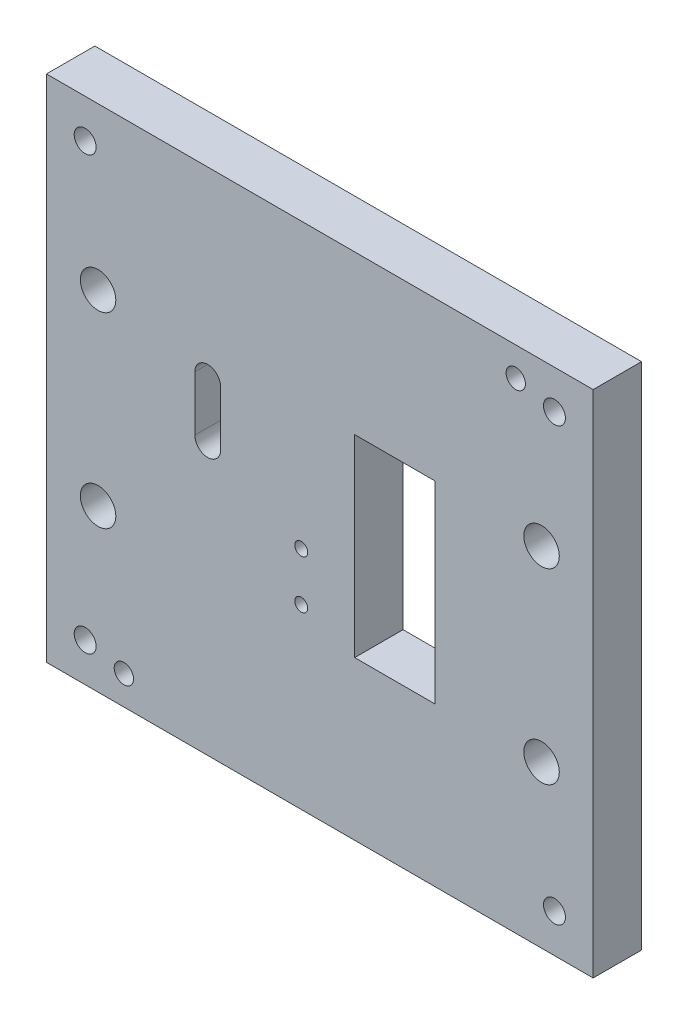
ISO-10303-21;
HEADER;
FILE_DESCRIPTION(('STEP AP214'),'2;1');
FILE_NAME('part.step','',(''),(''),'','','');
FILE_SCHEMA(('AUTOMOTIVE_DESIGN { 1 0 10303 214 1 1 1 1 }'));
ENDSEC;
DATA;
#1=APPLICATION_CONTEXT('core data for automotive mechanical design processes');
#2=APPLICATION_PROTOCOL_DEFINITION('international standard','automotive_design',2000,#1);
#3=PRODUCT_CONTEXT('',#1,'mechanical');
#4=PRODUCT('Part','Part','',(#3));
#5=PRODUCT_RELATED_PRODUCT_CATEGORY('part','',(#4));
#6=PRODUCT_DEFINITION_FORMATION('','',#4);
#7=PRODUCT_DEFINITION_CONTEXT('part definition',#1,'design');
#8=PRODUCT_DEFINITION('design','',#6,#7);
#9=PRODUCT_DEFINITION_SHAPE('','',#8);
#10=(LENGTH_UNIT() NAMED_UNIT(*) SI_UNIT(.MILLI.,.METRE.));
#11=(NAMED_UNIT(*) PLANE_ANGLE_UNIT() SI_UNIT($,.RADIAN.));
#12=(NAMED_UNIT(*) SI_UNIT($,.STERADIAN.) SOLID_ANGLE_UNIT());
#13=UNCERTAINTY_MEASURE_WITH_UNIT(LENGTH_MEASURE(1.E-05),#10,'distance_accuracy_value','');
#14=(GEOMETRIC_REPRESENTATION_CONTEXT(3) GLOBAL_UNCERTAINTY_ASSIGNED_CONTEXT((#13)) GLOBAL_UNIT_ASSIGNED_CONTEXT((#10,
#11,#12)) REPRESENTATION_CONTEXT('',''));
#15=CARTESIAN_POINT('',(0.,0.,0.));
#16=DIRECTION('',(0.,0.,1.));
#17=DIRECTION('',(1.,0.,0.));
#18=AXIS2_PLACEMENT_3D('',#15,#16,#17);
#19=CARTESIAN_POINT('',(0.,0.,0.));
#20=DIRECTION('',(0.,0.,-1.));
#21=DIRECTION('',(-1.,0.,0.));
#22=AXIS2_PLACEMENT_3D('',#19,#20,#21);
#23=PLANE('',#22);
#24=CARTESIAN_POINT('',(-34.,29.0000000000001,0.));
#25=DIRECTION('',(0.,0.,1.));
#26=DIRECTION('',(1.,0.,0.));
#27=AXIS2_PLACEMENT_3D('',#24,#25,#26);
#28=CIRCLE('',#27,5.49999999999999);
#29=CARTESIAN_POINT('',(-28.5,29.0000000000001,0.));
#30=VERTEX_POINT('',#29);
#31=EDGE_CURVE('E446',#30,#30,#28,.T.);
#32=ORIENTED_EDGE('',*,*,#31,.F.);
#33=EDGE_LOOP('',(#32));
#34=FACE_BOUND('',#33,.T.);
#35=CARTESIAN_POINT('',(103.5,29.,0.));
#36=DIRECTION('',(0.,0.,1.));
#37=DIRECTION('',(1.,0.,0.));
#38=AXIS2_PLACEMENT_3D('',#35,#36,#37);
#39=CIRCLE('',#38,5.49999999999999);
#40=CARTESIAN_POINT('',(109.,29.,0.));
#41=VERTEX_POINT('',#40);
#42=EDGE_CURVE('E456',#41,#41,#39,.T.);
#43=ORIENTED_EDGE('',*,*,#42,.F.);
#44=EDGE_LOOP('',(#43));
#45=FACE_BOUND('',#44,.T.);
#46=CARTESIAN_POINT('',(103.5,-29.,0.));
#47=DIRECTION('',(0.,0.,1.));
#48=DIRECTION('',(1.,0.,0.));
#49=AXIS2_PLACEMENT_3D('',#46,#47,#48);
#50=CIRCLE('',#49,5.49999999999999);
#51=CARTESIAN_POINT('',(109.,-29.,0.));
#52=VERTEX_POINT('',#51);
#53=EDGE_CURVE('E462',#52,#52,#50,.T.);
#54=ORIENTED_EDGE('',*,*,#53,.F.);
#55=EDGE_LOOP('',(#54));
#56=FACE_BOUND('',#55,.T.);
#57=CARTESIAN_POINT('',(95.5,70.0000000000001,0.));
#58=DIRECTION('',(0.,0.,1.));
#59=DIRECTION('',(1.,0.,0.));
#60=AXIS2_PLACEMENT_3D('',#57,#58,#59);
#61=CIRCLE('',#60,2.99999999999999);
#62=CARTESIAN_POINT('',(98.5,70.0000000000001,0.));
#63=VERTEX_POINT('',#62);
#64=EDGE_CURVE('E490',#63,#63,#61,.T.);
#65=ORIENTED_EDGE('',*,*,#64,.F.);
#66=EDGE_LOOP('',(#65));
#67=FACE_BOUND('',#66,.T.);
#68=CARTESIAN_POINT('',(-26.0000000000001,-70.0000000000001,0.));
#69=DIRECTION('',(0.,0.,1.));
#70=DIRECTION('',(1.,0.,0.));
#71=AXIS2_PLACEMENT_3D('',#68,#69,#70);
#72=CIRCLE('',#71,2.99999999999999);
#73=CARTESIAN_POINT('',(-23.0000000000001,-70.0000000000001,0.));
#74=VERTEX_POINT('',#73);
#75=EDGE_CURVE('E498',#74,#74,#72,.T.);
#76=ORIENTED_EDGE('',*,*,#75,.F.);
#77=EDGE_LOOP('',(#76));
#78=FACE_BOUND('',#77,.T.);
#79=CARTESIAN_POINT('',(107.5,-67.0000000000001,0.));
#80=DIRECTION('',(0.,0.,1.));
#81=DIRECTION('',(1.,0.,0.));
#82=AXIS2_PLACEMENT_3D('',#79,#80,#81);
#83=CIRCLE('',#82,3.4);
#84=CARTESIAN_POINT('',(110.9,-67.0000000000001,0.));
#85=VERTEX_POINT('',#84);
#86=EDGE_CURVE('E154',#85,#85,#83,.T.);
#87=ORIENTED_EDGE('',*,*,#86,.F.);
#88=EDGE_LOOP('',(#87));
#89=FACE_BOUND('',#88,.T.);
#90=CARTESIAN_POINT('',(107.5,67.,0.));
#91=DIRECTION('',(0.,0.,1.));
#92=DIRECTION('',(1.,0.,0.));
#93=AXIS2_PLACEMENT_3D('',#90,#91,#92);
#94=CIRCLE('',#93,3.4);
#95=CARTESIAN_POINT('',(110.9,67.,0.));
#96=VERTEX_POINT('',#95);
#97=EDGE_CURVE('E153',#96,#96,#94,.T.);
#98=ORIENTED_EDGE('',*,*,#97,.F.);
#99=EDGE_LOOP('',(#98));
#100=FACE_BOUND('',#99,.T.);
#101=CARTESIAN_POINT('',(-38.0000000000001,67.0000000000001,0.));
#102=DIRECTION('',(0.,0.,1.));
#103=DIRECTION('',(1.,0.,0.));
#104=AXIS2_PLACEMENT_3D('',#101,#102,#103);
#105=CIRCLE('',#104,3.4);
#106=CARTESIAN_POINT('',(-34.6000000000001,67.0000000000001,0.));
#107=VERTEX_POINT('',#106);
#108=EDGE_CURVE('E166',#107,#107,#105,.T.);
#109=ORIENTED_EDGE('',*,*,#108,.F.);
#110=EDGE_LOOP('',(#109));
#111=FACE_BOUND('',#110,.T.);
#112=CARTESIAN_POINT('',(-38.0000000000001,-67.0000000000001,0.));
#113=DIRECTION('',(0.,0.,1.));
#114=DIRECTION('',(1.,0.,0.));
#115=AXIS2_PLACEMENT_3D('',#112,#113,#114);
#116=CIRCLE('',#115,3.4);
#117=CARTESIAN_POINT('',(-34.6000000000001,-67.0000000000001,0.));
#118=VERTEX_POINT('',#117);
#119=EDGE_CURVE('E172',#118,#118,#116,.T.);
#120=ORIENTED_EDGE('',*,*,#119,.F.);
#121=EDGE_LOOP('',(#120));
#122=FACE_BOUND('',#121,.T.);
#123=CARTESIAN_POINT('',(29.,-24.,0.));
#124=DIRECTION('',(0.,0.,1.));
#125=DIRECTION('',(1.,0.,0.));
#126=AXIS2_PLACEMENT_3D('',#123,#124,#125);
#127=CIRCLE('',#126,2.00000000000001);
#128=CARTESIAN_POINT('',(31.,-24.,0.));
#129=VERTEX_POINT('',#128);
#130=EDGE_CURVE('E178',#129,#129,#127,.T.);
#131=ORIENTED_EDGE('',*,*,#130,.F.);
#132=EDGE_LOOP('',(#131));
#133=FACE_BOUND('',#132,.T.);
#134=CARTESIAN_POINT('',(29.,-8.99999999999998,0.));
#135=DIRECTION('',(0.,0.,1.));
#136=DIRECTION('',(1.,0.,0.));
#137=AXIS2_PLACEMENT_3D('',#134,#135,#136);
#138=CIRCLE('',#137,2.);
#139=CARTESIAN_POINT('',(31.,-8.99999999999998,0.));
#140=VERTEX_POINT('',#139);
#141=EDGE_CURVE('E182',#140,#140,#138,.T.);
#142=ORIENTED_EDGE('',*,*,#141,.F.);
#143=EDGE_LOOP('',(#142));
#144=FACE_BOUND('',#143,.T.);
#145=DIRECTION('',(0.,-1.,0.));
#146=VECTOR('',#145,1.);
#147=CARTESIAN_POINT('',(-4.,22.,0.));
#148=LINE('',#147,#146);
#149=CARTESIAN_POINT('',(-4.,22.,0.));
#150=VERTEX_POINT('',#149);
#151=CARTESIAN_POINT('',(-4.,5.00000000000001,0.));
#152=VERTEX_POINT('',#151);
#153=EDGE_CURVE('E203',#150,#152,#148,.T.);
#154=ORIENTED_EDGE('',*,*,#153,.F.);
#155=CARTESIAN_POINT('',(0.,22.,0.));
#156=DIRECTION('',(0.,0.,1.));
#157=DIRECTION('',(1.,0.,0.));
#158=AXIS2_PLACEMENT_3D('',#155,#156,#157);
#159=CIRCLE('',#158,4.);
#160=CARTESIAN_POINT('',(4.,22.,0.));
#161=VERTEX_POINT('',#160);
#162=EDGE_CURVE('E68',#161,#150,#159,.T.);
#163=ORIENTED_EDGE('',*,*,#162,.F.);
#164=DIRECTION('',(0.,1.,0.));
#165=VECTOR('',#164,1.);
#166=CARTESIAN_POINT('',(4.,5.00000000000001,0.));
#167=LINE('',#166,#165);
#168=CARTESIAN_POINT('',(4.,5.00000000000001,0.));
#169=VERTEX_POINT('',#168);
#170=EDGE_CURVE('E194',#169,#161,#167,.T.);
#171=ORIENTED_EDGE('',*,*,#170,.F.);
#172=CARTESIAN_POINT('',(0.,5.00000000000001,0.));
#173=DIRECTION('',(0.,0.,1.));
#174=DIRECTION('',(1.,0.,0.));
#175=AXIS2_PLACEMENT_3D('',#172,#173,#174);
#176=CIRCLE('',#175,4.);
#177=EDGE_CURVE('E206',#152,#169,#176,.T.);
#178=ORIENTED_EDGE('',*,*,#177,.F.);
#179=EDGE_LOOP('',(#154,#163,#171,#178));
#180=FACE_BOUND('',#179,.T.);
#181=DIRECTION('',(1.,0.,0.));
#182=VECTOR('',#181,1.);
#183=CARTESIAN_POINT('',(45.56,-29.94,0.));
#184=LINE('',#183,#182);
#185=CARTESIAN_POINT('',(45.56,-29.94,0.));
#186=VERTEX_POINT('',#185);
#187=CARTESIAN_POINT('',(70.44,-29.94,0.));
#188=VERTEX_POINT('',#187);
#189=EDGE_CURVE('E234',#186,#188,#184,.T.);
#190=ORIENTED_EDGE('',*,*,#189,.F.);
#191=DIRECTION('',(0.,-1.,0.));
#192=VECTOR('',#191,1.);
#193=CARTESIAN_POINT('',(45.56,29.94,0.));
#194=LINE('',#193,#192);
#195=CARTESIAN_POINT('',(45.56,29.94,0.));
#196=VERTEX_POINT('',#195);
#197=EDGE_CURVE('E213',#196,#186,#194,.T.);
#198=ORIENTED_EDGE('',*,*,#197,.F.);
#199=DIRECTION('',(-1.,0.,0.));
#200=VECTOR('',#199,1.);
#201=CARTESIAN_POINT('',(70.44,29.94,0.));
#202=LINE('',#201,#200);
#203=CARTESIAN_POINT('',(70.44,29.94,0.));
#204=VERTEX_POINT('',#203);
#205=EDGE_CURVE('E223',#204,#196,#202,.T.);
#206=ORIENTED_EDGE('',*,*,#205,.F.);
#207=DIRECTION('',(0.,1.,0.));
#208=VECTOR('',#207,1.);
#209=CARTESIAN_POINT('',(70.44,-29.94,0.));
#210=LINE('',#209,#208);
#211=EDGE_CURVE('E237',#188,#204,#210,.T.);
#212=ORIENTED_EDGE('',*,*,#211,.F.);
#213=EDGE_LOOP('',(#190,#198,#206,#212));
#214=FACE_BOUND('',#213,.T.);
#215=DIRECTION('',(1.,0.,0.));
#216=VECTOR('',#215,1.);
#217=CARTESIAN_POINT('',(-50.,-79.,0.));
#218=LINE('',#217,#216);
#219=CARTESIAN_POINT('',(-50.,-79.,0.));
#220=VERTEX_POINT('',#219);
#221=CARTESIAN_POINT('',(119.5,-79.,0.));
#222=VERTEX_POINT('',#221);
#223=EDGE_CURVE('E244',#220,#222,#218,.T.);
#224=ORIENTED_EDGE('',*,*,#223,.T.);
#225=DIRECTION('',(0.,1.,0.));
#226=VECTOR('',#225,1.);
#227=CARTESIAN_POINT('',(119.5,79.0000000000001,0.));
#228=LINE('',#227,#226);
#229=CARTESIAN_POINT('',(119.5,79.0000000000001,0.));
#230=VERTEX_POINT('',#229);
#231=EDGE_CURVE('E266',#222,#230,#228,.T.);
#232=ORIENTED_EDGE('',*,*,#231,.T.);
#233=DIRECTION('',(-1.,0.,0.));
#234=VECTOR('',#233,1.);
#235=CARTESIAN_POINT('',(-50.,79.0000000000001,0.));
#236=LINE('',#235,#234);
#237=CARTESIAN_POINT('',(-50.,79.0000000000001,0.));
#238=VERTEX_POINT('',#237);
#239=EDGE_CURVE('E269',#230,#238,#236,.T.);
#240=ORIENTED_EDGE('',*,*,#239,.T.);
#241=DIRECTION('',(0.,-1.,0.));
#242=VECTOR('',#241,1.);
#243=CARTESIAN_POINT('',(-50.,79.0000000000001,0.));
#244=LINE('',#243,#242);
#245=EDGE_CURVE('E255',#238,#220,#244,.T.);
#246=ORIENTED_EDGE('',*,*,#245,.T.);
#247=EDGE_LOOP('',(#224,#232,#240,#246));
#248=FACE_BOUND('',#247,.T.);
#249=CARTESIAN_POINT('',(-34.,-29.,0.));
#250=DIRECTION('',(0.,0.,1.));
#251=DIRECTION('',(1.,0.,0.));
#252=AXIS2_PLACEMENT_3D('',#249,#250,#251);
#253=CIRCLE('',#252,5.49999999999999);
#254=CARTESIAN_POINT('',(-28.5,-29.,0.));
#255=VERTEX_POINT('',#254);
#256=EDGE_CURVE('E448',#255,#255,#253,.T.);
#257=ORIENTED_EDGE('',*,*,#256,.F.);
#258=EDGE_LOOP('',(#257));
#259=FACE_BOUND('',#258,.T.);
#260=ADVANCED_FACE('F43',(#34,#45,#56,#67,#78,#89,#100,#111,#122,#133,#144,#180,#214,#248,#259),
#23,.F.);
#261=CARTESIAN_POINT('',(-50.,-79.,-15.));
#262=DIRECTION('',(0.,-1.,0.));
#263=DIRECTION('',(0.,0.,-1.));
#264=AXIS2_PLACEMENT_3D('',#261,#262,#263);
#265=PLANE('',#264);
#266=ORIENTED_EDGE('',*,*,#223,.F.);
#267=DIRECTION('',(0.,0.,1.));
#268=VECTOR('',#267,1.);
#269=CARTESIAN_POINT('',(-50.,-79.,-15.));
#270=LINE('',#269,#268);
#271=CARTESIAN_POINT('',(-50.,-79.,-15.));
#272=VERTEX_POINT('',#271);
#273=EDGE_CURVE('E11',#272,#220,#270,.T.);
#274=ORIENTED_EDGE('',*,*,#273,.F.);
#275=DIRECTION('',(1.,0.,0.));
#276=VECTOR('',#275,1.);
#277=CARTESIAN_POINT('',(-50.,-79.,-15.));
#278=LINE('',#277,#276);
#279=CARTESIAN_POINT('',(119.5,-79.,-15.));
#280=VERTEX_POINT('',#279);
#281=EDGE_CURVE('E251',#272,#280,#278,.T.);
#282=ORIENTED_EDGE('',*,*,#281,.T.);
#283=DIRECTION('',(0.,0.,1.));
#284=VECTOR('',#283,1.);
#285=CARTESIAN_POINT('',(119.5,-79.,-15.));
#286=LINE('',#285,#284);
#287=EDGE_CURVE('E47',#280,#222,#286,.T.);
#288=ORIENTED_EDGE('',*,*,#287,.T.);
#289=EDGE_LOOP('',(#266,#274,#282,#288));
#290=FACE_BOUND('',#289,.T.);
#291=ADVANCED_FACE('F45',(#290),#265,.T.);
#292=CARTESIAN_POINT('',(-50.,79.0000000000001,-15.));
#293=DIRECTION('',(-1.,0.,0.));
#294=DIRECTION('',(0.,0.,1.));
#295=AXIS2_PLACEMENT_3D('',#292,#293,#294);
#296=PLANE('',#295);
#297=ORIENTED_EDGE('',*,*,#245,.F.);
#298=DIRECTION('',(0.,0.,1.));
#299=VECTOR('',#298,1.);
#300=CARTESIAN_POINT('',(-50.,79.0000000000001,-15.));
#301=LINE('',#300,#299);
#302=CARTESIAN_POINT('',(-50.,79.0000000000001,-15.));
#303=VERTEX_POINT('',#302);
#304=EDGE_CURVE('E52',#303,#238,#301,.T.);
#305=ORIENTED_EDGE('',*,*,#304,.F.);
#306=DIRECTION('',(0.,-1.,0.));
#307=VECTOR('',#306,1.);
#308=CARTESIAN_POINT('',(-50.,79.0000000000001,-15.));
#309=LINE('',#308,#307);
#310=EDGE_CURVE('E261',#303,#272,#309,.T.);
#311=ORIENTED_EDGE('',*,*,#310,.T.);
#312=ORIENTED_EDGE('',*,*,#273,.T.);
#313=EDGE_LOOP('',(#297,#305,#311,#312));
#314=FACE_BOUND('',#313,.T.);
#315=ADVANCED_FACE('F287',(#314),#296,.T.);
#316=CARTESIAN_POINT('',(-50.,79.0000000000001,-15.));
#317=DIRECTION('',(0.,1.,0.));
#318=DIRECTION('',(0.,0.,1.));
#319=AXIS2_PLACEMENT_3D('',#316,#317,#318);
#320=PLANE('',#319);
#321=ORIENTED_EDGE('',*,*,#239,.F.);
#322=DIRECTION('',(0.,0.,1.));
#323=VECTOR('',#322,1.);
#324=CARTESIAN_POINT('',(119.5,79.0000000000001,-15.));
#325=LINE('',#324,#323);
#326=CARTESIAN_POINT('',(119.5,79.0000000000001,-15.));
#327=VERTEX_POINT('',#326);
#328=EDGE_CURVE('E274',#327,#230,#325,.T.);
#329=ORIENTED_EDGE('',*,*,#328,.F.);
#330=DIRECTION('',(-1.,0.,0.));
#331=VECTOR('',#330,1.);
#332=CARTESIAN_POINT('',(-50.,79.0000000000001,-15.));
#333=LINE('',#332,#331);
#334=EDGE_CURVE('E258',#327,#303,#333,.T.);
#335=ORIENTED_EDGE('',*,*,#334,.T.);
#336=ORIENTED_EDGE('',*,*,#304,.T.);
#337=EDGE_LOOP('',(#321,#329,#335,#336));
#338=FACE_BOUND('',#337,.T.);
#339=ADVANCED_FACE('F293',(#338),#320,.T.);
#340=CARTESIAN_POINT('',(119.5,79.0000000000001,-15.));
#341=DIRECTION('',(1.,0.,0.));
#342=DIRECTION('',(0.,1.,0.));
#343=AXIS2_PLACEMENT_3D('',#340,#341,#342);
#344=PLANE('',#343);
#345=ORIENTED_EDGE('',*,*,#231,.F.);
#346=ORIENTED_EDGE('',*,*,#287,.F.);
#347=DIRECTION('',(0.,1.,0.));
#348=VECTOR('',#347,1.);
#349=CARTESIAN_POINT('',(119.5,79.0000000000001,-15.));
#350=LINE('',#349,#348);
#351=EDGE_CURVE('E254',#280,#327,#350,.T.);
#352=ORIENTED_EDGE('',*,*,#351,.T.);
#353=ORIENTED_EDGE('',*,*,#328,.T.);
#354=EDGE_LOOP('',(#345,#346,#352,#353));
#355=FACE_BOUND('',#354,.T.);
#356=ADVANCED_FACE('F282',(#355),#344,.T.);
#357=CARTESIAN_POINT('',(0.,0.,-15.));
#358=DIRECTION('',(0.,0.,-1.));
#359=DIRECTION('',(-1.,0.,0.));
#360=AXIS2_PLACEMENT_3D('',#357,#358,#359);
#361=PLANE('',#360);
#362=CARTESIAN_POINT('',(103.5,-29.,-15.));
#363=DIRECTION('',(0.,0.,-1.));
#364=DIRECTION('',(-1.,0.,0.));
#365=AXIS2_PLACEMENT_3D('',#362,#363,#364);
#366=CIRCLE('',#365,14.);
#367=CARTESIAN_POINT('',(89.5,-29.,-15.));
#368=VERTEX_POINT('',#367);
#369=EDGE_CURVE('E482',#368,#368,#366,.T.);
#370=ORIENTED_EDGE('',*,*,#369,.F.);
#371=EDGE_LOOP('',(#370));
#372=FACE_BOUND('',#371,.T.);
#373=CARTESIAN_POINT('',(-34.,-29.,-15.));
#374=DIRECTION('',(0.,0.,-1.));
#375=DIRECTION('',(-1.,0.,0.));
#376=AXIS2_PLACEMENT_3D('',#373,#374,#375);
#377=CIRCLE('',#376,14.);
#378=CARTESIAN_POINT('',(-48.,-29.,-15.));
#379=VERTEX_POINT('',#378);
#380=EDGE_CURVE('E476',#379,#379,#377,.T.);
#381=ORIENTED_EDGE('',*,*,#380,.F.);
#382=EDGE_LOOP('',(#381));
#383=FACE_BOUND('',#382,.T.);
#384=CARTESIAN_POINT('',(-34.,29.0000000000001,-15.));
#385=DIRECTION('',(0.,0.,-1.));
#386=DIRECTION('',(-1.,0.,0.));
#387=AXIS2_PLACEMENT_3D('',#384,#385,#386);
#388=CIRCLE('',#387,14.);
#389=CARTESIAN_POINT('',(-48.,29.0000000000001,-15.));
#390=VERTEX_POINT('',#389);
#391=EDGE_CURVE('E469',#390,#390,#388,.T.);
#392=ORIENTED_EDGE('',*,*,#391,.F.);
#393=EDGE_LOOP('',(#392));
#394=FACE_BOUND('',#393,.T.);
#395=CARTESIAN_POINT('',(103.5,29.0000000000001,-15.));
#396=DIRECTION('',(0.,0.,-1.));
#397=DIRECTION('',(-1.,0.,0.));
#398=AXIS2_PLACEMENT_3D('',#395,#396,#397);
#399=CIRCLE('',#398,14.);
#400=CARTESIAN_POINT('',(89.5,29.0000000000001,-15.));
#401=VERTEX_POINT('',#400);
#402=EDGE_CURVE('E472',#401,#401,#399,.T.);
#403=ORIENTED_EDGE('',*,*,#402,.F.);
#404=EDGE_LOOP('',(#403));
#405=FACE_BOUND('',#404,.T.);
#406=CARTESIAN_POINT('',(29.,-24.,-15.));
#407=DIRECTION('',(0.,0.,1.));
#408=DIRECTION('',(1.,0.,0.));
#409=AXIS2_PLACEMENT_3D('',#406,#407,#408);
#410=CIRCLE('',#409,2.00000000000001);
#411=CARTESIAN_POINT('',(31.,-24.,-15.));
#412=VERTEX_POINT('',#411);
#413=EDGE_CURVE('E179',#412,#412,#410,.T.);
#414=ORIENTED_EDGE('',*,*,#413,.T.);
#415=EDGE_LOOP('',(#414));
#416=FACE_BOUND('',#415,.T.);
#417=CARTESIAN_POINT('',(29.,-8.99999999999998,-15.));
#418=DIRECTION('',(0.,0.,1.));
#419=DIRECTION('',(1.,0.,0.));
#420=AXIS2_PLACEMENT_3D('',#417,#418,#419);
#421=CIRCLE('',#420,2.);
#422=CARTESIAN_POINT('',(31.,-8.99999999999998,-15.));
#423=VERTEX_POINT('',#422);
#424=EDGE_CURVE('E185',#423,#423,#421,.T.);
#425=ORIENTED_EDGE('',*,*,#424,.T.);
#426=EDGE_LOOP('',(#425));
#427=FACE_BOUND('',#426,.T.);
#428=CARTESIAN_POINT('',(0.,22.,-15.));
#429=DIRECTION('',(0.,0.,1.));
#430=DIRECTION('',(1.,0.,0.));
#431=AXIS2_PLACEMENT_3D('',#428,#429,#430);
#432=CIRCLE('',#431,4.);
#433=CARTESIAN_POINT('',(4.,22.,-15.));
#434=VERTEX_POINT('',#433);
#435=CARTESIAN_POINT('',(-4.,22.,-15.));
#436=VERTEX_POINT('',#435);
#437=EDGE_CURVE('E190',#434,#436,#432,.T.);
#438=ORIENTED_EDGE('',*,*,#437,.T.);
#439=DIRECTION('',(0.,-1.,0.));
#440=VECTOR('',#439,1.);
#441=CARTESIAN_POINT('',(-4.,22.,-15.));
#442=LINE('',#441,#440);
#443=CARTESIAN_POINT('',(-4.,5.00000000000001,-15.));
#444=VERTEX_POINT('',#443);
#445=EDGE_CURVE('E193',#436,#444,#442,.T.);
#446=ORIENTED_EDGE('',*,*,#445,.T.);
#447=CARTESIAN_POINT('',(0.,5.00000000000001,-15.));
#448=DIRECTION('',(0.,0.,1.));
#449=DIRECTION('',(1.,0.,0.));
#450=AXIS2_PLACEMENT_3D('',#447,#448,#449);
#451=CIRCLE('',#450,4.);
#452=CARTESIAN_POINT('',(4.,5.00000000000001,-15.));
#453=VERTEX_POINT('',#452);
#454=EDGE_CURVE('E60',#444,#453,#451,.T.);
#455=ORIENTED_EDGE('',*,*,#454,.T.);
#456=DIRECTION('',(0.,1.,0.));
#457=VECTOR('',#456,1.);
#458=CARTESIAN_POINT('',(4.,5.00000000000001,-15.));
#459=LINE('',#458,#457);
#460=EDGE_CURVE('E198',#453,#434,#459,.T.);
#461=ORIENTED_EDGE('',*,*,#460,.T.);
#462=EDGE_LOOP('',(#438,#446,#455,#461));
#463=FACE_BOUND('',#462,.T.);
#464=DIRECTION('',(0.,-1.,0.));
#465=VECTOR('',#464,1.);
#466=CARTESIAN_POINT('',(45.56,29.94,-15.));
#467=LINE('',#466,#465);
#468=CARTESIAN_POINT('',(45.56,29.94,-15.));
#469=VERTEX_POINT('',#468);
#470=CARTESIAN_POINT('',(45.56,-29.94,-15.));
#471=VERTEX_POINT('',#470);
#472=EDGE_CURVE('E219',#469,#471,#467,.T.);
#473=ORIENTED_EDGE('',*,*,#472,.T.);
#474=DIRECTION('',(1.,0.,0.));
#475=VECTOR('',#474,1.);
#476=CARTESIAN_POINT('',(45.56,-29.94,-15.));
#477=LINE('',#476,#475);
#478=CARTESIAN_POINT('',(70.44,-29.94,-15.));
#479=VERTEX_POINT('',#478);
#480=EDGE_CURVE('E222',#471,#479,#477,.T.);
#481=ORIENTED_EDGE('',*,*,#480,.T.);
#482=DIRECTION('',(0.,1.,0.));
#483=VECTOR('',#482,1.);
#484=CARTESIAN_POINT('',(70.44,-29.94,-15.));
#485=LINE('',#484,#483);
#486=CARTESIAN_POINT('',(70.44,29.94,-15.));
#487=VERTEX_POINT('',#486);
#488=EDGE_CURVE('E226',#479,#487,#485,.T.);
#489=ORIENTED_EDGE('',*,*,#488,.T.);
#490=DIRECTION('',(-1.,0.,0.));
#491=VECTOR('',#490,1.);
#492=CARTESIAN_POINT('',(70.44,29.94,-15.));
#493=LINE('',#492,#491);
#494=EDGE_CURVE('E229',#487,#469,#493,.T.);
#495=ORIENTED_EDGE('',*,*,#494,.T.);
#496=EDGE_LOOP('',(#473,#481,#489,#495));
#497=FACE_BOUND('',#496,.T.);
#498=ORIENTED_EDGE('',*,*,#281,.F.);
#499=ORIENTED_EDGE('',*,*,#310,.F.);
#500=ORIENTED_EDGE('',*,*,#334,.F.);
#501=ORIENTED_EDGE('',*,*,#351,.F.);
#502=EDGE_LOOP('',(#498,#499,#500,#501));
#503=FACE_BOUND('',#502,.T.);
#504=ADVANCED_FACE('F290',(#372,#383,#394,#405,#416,#427,#463,#497,#503),#361,.T.);
#505=CARTESIAN_POINT('',(45.56,29.94,-15.));
#506=DIRECTION('',(-1.,0.,0.));
#507=DIRECTION('',(0.,0.,1.));
#508=AXIS2_PLACEMENT_3D('',#505,#506,#507);
#509=PLANE('',#508);
#510=ORIENTED_EDGE('',*,*,#197,.T.);
#511=DIRECTION('',(0.,0.,1.));
#512=VECTOR('',#511,1.);
#513=CARTESIAN_POINT('',(45.56,-29.94,-15.));
#514=LINE('',#513,#512);
#515=EDGE_CURVE('E232',#471,#186,#514,.T.);
#516=ORIENTED_EDGE('',*,*,#515,.F.);
#517=ORIENTED_EDGE('',*,*,#472,.F.);
#518=DIRECTION('',(0.,0.,1.));
#519=VECTOR('',#518,1.);
#520=CARTESIAN_POINT('',(45.56,29.94,-15.));
#521=LINE('',#520,#519);
#522=EDGE_CURVE('E242',#469,#196,#521,.T.);
#523=ORIENTED_EDGE('',*,*,#522,.T.);
#524=EDGE_LOOP('',(#510,#516,#517,#523));
#525=FACE_BOUND('',#524,.T.);
#526=ADVANCED_FACE('F312',(#525),#509,.F.);
#527=CARTESIAN_POINT('',(70.44,29.94,-15.));
#528=DIRECTION('',(0.,1.,0.));
#529=DIRECTION('',(0.,0.,1.));
#530=AXIS2_PLACEMENT_3D('',#527,#528,#529);
#531=PLANE('',#530);
#532=ORIENTED_EDGE('',*,*,#205,.T.);
#533=ORIENTED_EDGE('',*,*,#522,.F.);
#534=ORIENTED_EDGE('',*,*,#494,.F.);
#535=DIRECTION('',(0.,0.,1.));
#536=VECTOR('',#535,1.);
#537=CARTESIAN_POINT('',(70.44,29.94,-15.));
#538=LINE('',#537,#536);
#539=EDGE_CURVE('E245',#487,#204,#538,.T.);
#540=ORIENTED_EDGE('',*,*,#539,.T.);
#541=EDGE_LOOP('',(#532,#533,#534,#540));
#542=FACE_BOUND('',#541,.T.);
#543=ADVANCED_FACE('F316',(#542),#531,.F.);
#544=CARTESIAN_POINT('',(70.44,-29.94,-15.));
#545=DIRECTION('',(1.,0.,0.));
#546=DIRECTION('',(0.,0.,-1.));
#547=AXIS2_PLACEMENT_3D('',#544,#545,#546);
#548=PLANE('',#547);
#549=ORIENTED_EDGE('',*,*,#211,.T.);
#550=ORIENTED_EDGE('',*,*,#539,.F.);
#551=ORIENTED_EDGE('',*,*,#488,.F.);
#552=DIRECTION('',(0.,0.,1.));
#553=VECTOR('',#552,1.);
#554=CARTESIAN_POINT('',(70.44,-29.94,-15.));
#555=LINE('',#554,#553);
#556=EDGE_CURVE('E247',#479,#188,#555,.T.);
#557=ORIENTED_EDGE('',*,*,#556,.T.);
#558=EDGE_LOOP('',(#549,#550,#551,#557));
#559=FACE_BOUND('',#558,.T.);
#560=ADVANCED_FACE('F322',(#559),#548,.F.);
#561=CARTESIAN_POINT('',(45.56,-29.94,-15.));
#562=DIRECTION('',(0.,-1.,0.));
#563=DIRECTION('',(0.,0.,-1.));
#564=AXIS2_PLACEMENT_3D('',#561,#562,#563);
#565=PLANE('',#564);
#566=ORIENTED_EDGE('',*,*,#189,.T.);
#567=ORIENTED_EDGE('',*,*,#556,.F.);
#568=ORIENTED_EDGE('',*,*,#480,.F.);
#569=ORIENTED_EDGE('',*,*,#515,.T.);
#570=EDGE_LOOP('',(#566,#567,#568,#569));
#571=FACE_BOUND('',#570,.T.);
#572=ADVANCED_FACE('F318',(#571),#565,.F.);
#573=CARTESIAN_POINT('',(0.,22.,-15.));
#574=DIRECTION('',(0.,0.,1.));
#575=DIRECTION('',(1.,0.,0.));
#576=AXIS2_PLACEMENT_3D('',#573,#574,#575);
#577=CYLINDRICAL_SURFACE('',#576,4.);
#578=ORIENTED_EDGE('',*,*,#162,.T.);
#579=DIRECTION('',(0.,0.,1.));
#580=VECTOR('',#579,1.);
#581=CARTESIAN_POINT('',(-4.,22.,-15.));
#582=LINE('',#581,#580);
#583=EDGE_CURVE('E201',#436,#150,#582,.T.);
#584=ORIENTED_EDGE('',*,*,#583,.F.);
#585=ORIENTED_EDGE('',*,*,#437,.F.);
#586=DIRECTION('',(0.,0.,1.));
#587=VECTOR('',#586,1.);
#588=CARTESIAN_POINT('',(4.,22.,-15.));
#589=LINE('',#588,#587);
#590=EDGE_CURVE('E211',#434,#161,#589,.T.);
#591=ORIENTED_EDGE('',*,*,#590,.T.);
#592=EDGE_LOOP('',(#578,#584,#585,#591));
#593=FACE_BOUND('',#592,.T.);
#594=ADVANCED_FACE('F321',(#593),#577,.F.);
#595=CARTESIAN_POINT('',(4.,5.00000000000001,-15.));
#596=DIRECTION('',(1.,0.,0.));
#597=DIRECTION('',(0.,1.,0.));
#598=AXIS2_PLACEMENT_3D('',#595,#596,#597);
#599=PLANE('',#598);
#600=ORIENTED_EDGE('',*,*,#170,.T.);
#601=ORIENTED_EDGE('',*,*,#590,.F.);
#602=ORIENTED_EDGE('',*,*,#460,.F.);
#603=DIRECTION('',(0.,0.,1.));
#604=VECTOR('',#603,1.);
#605=CARTESIAN_POINT('',(4.,5.00000000000001,-15.));
#606=LINE('',#605,#604);
#607=EDGE_CURVE('E214',#453,#169,#606,.T.);
#608=ORIENTED_EDGE('',*,*,#607,.T.);
#609=EDGE_LOOP('',(#600,#601,#602,#608));
#610=FACE_BOUND('',#609,.T.);
#611=ADVANCED_FACE('F332',(#610),#599,.F.);
#612=CARTESIAN_POINT('',(0.,5.00000000000001,-15.));
#613=DIRECTION('',(0.,0.,1.));
#614=DIRECTION('',(1.,0.,0.));
#615=AXIS2_PLACEMENT_3D('',#612,#613,#614);
#616=CYLINDRICAL_SURFACE('',#615,4.);
#617=ORIENTED_EDGE('',*,*,#177,.T.);
#618=ORIENTED_EDGE('',*,*,#607,.F.);
#619=ORIENTED_EDGE('',*,*,#454,.F.);
#620=DIRECTION('',(0.,0.,1.));
#621=VECTOR('',#620,1.);
#622=CARTESIAN_POINT('',(-4.,5.00000000000001,-15.));
#623=LINE('',#622,#621);
#624=EDGE_CURVE('E216',#444,#152,#623,.T.);
#625=ORIENTED_EDGE('',*,*,#624,.T.);
#626=EDGE_LOOP('',(#617,#618,#619,#625));
#627=FACE_BOUND('',#626,.T.);
#628=ADVANCED_FACE('F337',(#627),#616,.F.);
#629=CARTESIAN_POINT('',(-4.,22.,-15.));
#630=DIRECTION('',(-1.,0.,0.));
#631=DIRECTION('',(0.,-1.,0.));
#632=AXIS2_PLACEMENT_3D('',#629,#630,#631);
#633=PLANE('',#632);
#634=ORIENTED_EDGE('',*,*,#153,.T.);
#635=ORIENTED_EDGE('',*,*,#624,.F.);
#636=ORIENTED_EDGE('',*,*,#445,.F.);
#637=ORIENTED_EDGE('',*,*,#583,.T.);
#638=EDGE_LOOP('',(#634,#635,#636,#637));
#639=FACE_BOUND('',#638,.T.);
#640=ADVANCED_FACE('F333',(#639),#633,.F.);
#641=CARTESIAN_POINT('',(29.,-8.99999999999998,-15.));
#642=DIRECTION('',(0.,0.,1.));
#643=DIRECTION('',(1.,0.,0.));
#644=AXIS2_PLACEMENT_3D('',#641,#642,#643);
#645=CYLINDRICAL_SURFACE('',#644,2.);
#646=ORIENTED_EDGE('',*,*,#424,.F.);
#647=EDGE_LOOP('',(#646));
#648=FACE_BOUND('',#647,.T.);
#649=ORIENTED_EDGE('',*,*,#141,.T.);
#650=EDGE_LOOP('',(#649));
#651=FACE_BOUND('',#650,.T.);
#652=ADVANCED_FACE('F336',(#648,#651),#645,.F.);
#653=CARTESIAN_POINT('',(29.,-24.,-15.));
#654=DIRECTION('',(0.,0.,1.));
#655=DIRECTION('',(1.,0.,0.));
#656=AXIS2_PLACEMENT_3D('',#653,#654,#655);
#657=CYLINDRICAL_SURFACE('',#656,2.00000000000001);
#658=ORIENTED_EDGE('',*,*,#413,.F.);
#659=EDGE_LOOP('',(#658));
#660=FACE_BOUND('',#659,.T.);
#661=ORIENTED_EDGE('',*,*,#130,.T.);
#662=EDGE_LOOP('',(#661));
#663=FACE_BOUND('',#662,.T.);
#664=ADVANCED_FACE('F346',(#660,#663),#657,.F.);
#665=CARTESIAN_POINT('',(-38.0000000000001,-67.0000000000001,-7.5));
#666=DIRECTION('',(0.,0.,1.));
#667=DIRECTION('',(1.,0.,0.));
#668=AXIS2_PLACEMENT_3D('',#665,#666,#667);
#669=CONICAL_SURFACE('',#668,3.39999999999999,1.02974425867665);
#670=CARTESIAN_POINT('',(-38.0000000000001,-67.0000000000001,-9.5429261046937));
#671=VERTEX_POINT('',#670);
#672=VERTEX_LOOP('',#671);
#673=FACE_BOUND('',#672,.T.);
#674=CARTESIAN_POINT('',(-38.0000000000001,-67.0000000000001,-7.5));
#675=DIRECTION('',(0.,0.,1.));
#676=DIRECTION('',(1.,0.,0.));
#677=AXIS2_PLACEMENT_3D('',#674,#675,#676);
#678=CIRCLE('',#677,3.39999999999999);
#679=CARTESIAN_POINT('',(-34.6000000000001,-67.0000000000001,-7.5));
#680=VERTEX_POINT('',#679);
#681=EDGE_CURVE('E175',#680,#680,#678,.T.);
#682=ORIENTED_EDGE('',*,*,#681,.T.);
#683=EDGE_LOOP('',(#682));
#684=FACE_BOUND('',#683,.T.);
#685=ADVANCED_FACE('F350',(#673,#684),#669,.F.);
#686=CARTESIAN_POINT('',(-38.0000000000001,-67.0000000000001,0.));
#687=DIRECTION('',(0.,0.,1.));
#688=DIRECTION('',(1.,0.,0.));
#689=AXIS2_PLACEMENT_3D('',#686,#687,#688);
#690=CYLINDRICAL_SURFACE('',#689,3.4);
#691=ORIENTED_EDGE('',*,*,#681,.F.);
#692=EDGE_LOOP('',(#691));
#693=FACE_BOUND('',#692,.T.);
#694=ORIENTED_EDGE('',*,*,#119,.T.);
#695=EDGE_LOOP('',(#694));
#696=FACE_BOUND('',#695,.T.);
#697=ADVANCED_FACE('F354',(#693,#696),#690,.F.);
#698=CARTESIAN_POINT('',(-38.0000000000001,67.0000000000001,-7.5));
#699=DIRECTION('',(0.,0.,1.));
#700=DIRECTION('',(1.,0.,0.));
#701=AXIS2_PLACEMENT_3D('',#698,#699,#700);
#702=CONICAL_SURFACE('',#701,3.39999999999999,1.02974425867665);
#703=CARTESIAN_POINT('',(-38.0000000000001,67.0000000000001,-9.5429261046937));
#704=VERTEX_POINT('',#703);
#705=VERTEX_LOOP('',#704);
#706=FACE_BOUND('',#705,.T.);
#707=CARTESIAN_POINT('',(-38.0000000000001,67.0000000000001,-7.5));
#708=DIRECTION('',(0.,0.,1.));
#709=DIRECTION('',(1.,0.,0.));
#710=AXIS2_PLACEMENT_3D('',#707,#708,#709);
#711=CIRCLE('',#710,3.39999999999999);
#712=CARTESIAN_POINT('',(-34.6000000000001,67.0000000000001,-7.5));
#713=VERTEX_POINT('',#712);
#714=EDGE_CURVE('E169',#713,#713,#711,.T.);
#715=ORIENTED_EDGE('',*,*,#714,.T.);
#716=EDGE_LOOP('',(#715));
#717=FACE_BOUND('',#716,.T.);
#718=ADVANCED_FACE('F358',(#706,#717),#702,.F.);
#719=CARTESIAN_POINT('',(-38.0000000000001,67.0000000000001,0.));
#720=DIRECTION('',(0.,0.,1.));
#721=DIRECTION('',(1.,0.,0.));
#722=AXIS2_PLACEMENT_3D('',#719,#720,#721);
#723=CYLINDRICAL_SURFACE('',#722,3.4);
#724=ORIENTED_EDGE('',*,*,#714,.F.);
#725=EDGE_LOOP('',(#724));
#726=FACE_BOUND('',#725,.T.);
#727=ORIENTED_EDGE('',*,*,#108,.T.);
#728=EDGE_LOOP('',(#727));
#729=FACE_BOUND('',#728,.T.);
#730=ADVANCED_FACE('F362',(#726,#729),#723,.F.);
#731=CARTESIAN_POINT('',(107.5,67.,-7.5));
#732=DIRECTION('',(0.,0.,1.));
#733=DIRECTION('',(1.,0.,0.));
#734=AXIS2_PLACEMENT_3D('',#731,#732,#733);
#735=CONICAL_SURFACE('',#734,3.4,1.02974425867665);
#736=CARTESIAN_POINT('',(107.5,67.,-9.5429261046937));
#737=VERTEX_POINT('',#736);
#738=VERTEX_LOOP('',#737);
#739=FACE_BOUND('',#738,.T.);
#740=CARTESIAN_POINT('',(107.5,67.,-7.5));
#741=DIRECTION('',(0.,0.,1.));
#742=DIRECTION('',(1.,0.,0.));
#743=AXIS2_PLACEMENT_3D('',#740,#741,#742);
#744=CIRCLE('',#743,3.4);
#745=CARTESIAN_POINT('',(110.9,67.,-7.5));
#746=VERTEX_POINT('',#745);
#747=EDGE_CURVE('E157',#746,#746,#744,.T.);
#748=ORIENTED_EDGE('',*,*,#747,.T.);
#749=EDGE_LOOP('',(#748));
#750=FACE_BOUND('',#749,.T.);
#751=ADVANCED_FACE('F366',(#739,#750),#735,.F.);
#752=CARTESIAN_POINT('',(107.5,67.,0.));
#753=DIRECTION('',(0.,0.,1.));
#754=DIRECTION('',(1.,0.,0.));
#755=AXIS2_PLACEMENT_3D('',#752,#753,#754);
#756=CYLINDRICAL_SURFACE('',#755,3.4);
#757=ORIENTED_EDGE('',*,*,#747,.F.);
#758=EDGE_LOOP('',(#757));
#759=FACE_BOUND('',#758,.T.);
#760=ORIENTED_EDGE('',*,*,#97,.T.);
#761=EDGE_LOOP('',(#760));
#762=FACE_BOUND('',#761,.T.);
#763=ADVANCED_FACE('F147',(#759,#762),#756,.F.);
#764=CARTESIAN_POINT('',(107.5,-67.0000000000001,-7.5));
#765=DIRECTION('',(0.,0.,1.));
#766=DIRECTION('',(1.,0.,0.));
#767=AXIS2_PLACEMENT_3D('',#764,#765,#766);
#768=CONICAL_SURFACE('',#767,3.4,1.02974425867665);
#769=CARTESIAN_POINT('',(107.5,-67.0000000000001,-9.5429261046937));
#770=VERTEX_POINT('',#769);
#771=VERTEX_LOOP('',#770);
#772=FACE_BOUND('',#771,.T.);
#773=CARTESIAN_POINT('',(107.5,-67.0000000000001,-7.5));
#774=DIRECTION('',(0.,0.,1.));
#775=DIRECTION('',(1.,0.,0.));
#776=AXIS2_PLACEMENT_3D('',#773,#774,#775);
#777=CIRCLE('',#776,3.4);
#778=CARTESIAN_POINT('',(110.9,-67.0000000000001,-7.5));
#779=VERTEX_POINT('',#778);
#780=EDGE_CURVE('E151',#779,#779,#777,.T.);
#781=ORIENTED_EDGE('',*,*,#780,.T.);
#782=EDGE_LOOP('',(#781));
#783=FACE_BOUND('',#782,.T.);
#784=ADVANCED_FACE('F143',(#772,#783),#768,.F.);
#785=CARTESIAN_POINT('',(107.5,-67.0000000000001,0.));
#786=DIRECTION('',(0.,0.,1.));
#787=DIRECTION('',(1.,0.,0.));
#788=AXIS2_PLACEMENT_3D('',#785,#786,#787);
#789=CYLINDRICAL_SURFACE('',#788,3.4);
#790=ORIENTED_EDGE('',*,*,#780,.F.);
#791=EDGE_LOOP('',(#790));
#792=FACE_BOUND('',#791,.T.);
#793=ORIENTED_EDGE('',*,*,#86,.T.);
#794=EDGE_LOOP('',(#793));
#795=FACE_BOUND('',#794,.T.);
#796=ADVANCED_FACE('F146',(#792,#795),#789,.F.);
#797=CARTESIAN_POINT('',(-26.0000000000001,-70.0000000000001,-10.));
#798=DIRECTION('',(0.,0.,-1.));
#799=DIRECTION('',(-1.,0.,0.));
#800=AXIS2_PLACEMENT_3D('',#797,#798,#799);
#801=PLANE('',#800);
#802=CARTESIAN_POINT('',(-26.0000000000001,-70.0000000000001,-10.));
#803=DIRECTION('',(0.,0.,1.));
#804=DIRECTION('',(1.,0.,0.));
#805=AXIS2_PLACEMENT_3D('',#802,#803,#804);
#806=CIRCLE('',#805,3.);
#807=CARTESIAN_POINT('',(-23.0000000000001,-70.0000000000001,-10.));
#808=VERTEX_POINT('',#807);
#809=EDGE_CURVE('E160',#808,#808,#806,.T.);
#810=ORIENTED_EDGE('',*,*,#809,.T.);
#811=EDGE_LOOP('',(#810));
#812=FACE_BOUND('',#811,.T.);
#813=ADVANCED_FACE('F376',(#812),#801,.F.);
#814=CARTESIAN_POINT('',(-26.0000000000001,-70.0000000000001,0.));
#815=DIRECTION('',(0.,0.,1.));
#816=DIRECTION('',(1.,0.,0.));
#817=AXIS2_PLACEMENT_3D('',#814,#815,#816);
#818=CYLINDRICAL_SURFACE('',#817,2.99999999999999);
#819=ORIENTED_EDGE('',*,*,#809,.F.);
#820=EDGE_LOOP('',(#819));
#821=FACE_BOUND('',#820,.T.);
#822=ORIENTED_EDGE('',*,*,#75,.T.);
#823=EDGE_LOOP('',(#822));
#824=FACE_BOUND('',#823,.T.);
#825=ADVANCED_FACE('F379',(#821,#824),#818,.F.);
#826=CARTESIAN_POINT('',(95.5,70.0000000000001,-10.));
#827=DIRECTION('',(0.,0.,-1.));
#828=DIRECTION('',(-1.,0.,0.));
#829=AXIS2_PLACEMENT_3D('',#826,#827,#828);
#830=PLANE('',#829);
#831=CARTESIAN_POINT('',(95.5,70.0000000000001,-10.));
#832=DIRECTION('',(0.,0.,1.));
#833=DIRECTION('',(1.,0.,0.));
#834=AXIS2_PLACEMENT_3D('',#831,#832,#833);
#835=CIRCLE('',#834,3.);
#836=CARTESIAN_POINT('',(98.5,70.0000000000001,-10.));
#837=VERTEX_POINT('',#836);
#838=EDGE_CURVE('E495',#837,#837,#835,.T.);
#839=ORIENTED_EDGE('',*,*,#838,.T.);
#840=EDGE_LOOP('',(#839));
#841=FACE_BOUND('',#840,.T.);
#842=ADVANCED_FACE('F383',(#841),#830,.F.);
#843=CARTESIAN_POINT('',(95.5,70.0000000000001,0.));
#844=DIRECTION('',(0.,0.,1.));
#845=DIRECTION('',(1.,0.,0.));
#846=AXIS2_PLACEMENT_3D('',#843,#844,#845);
#847=CYLINDRICAL_SURFACE('',#846,3.);
#848=ORIENTED_EDGE('',*,*,#838,.F.);
#849=EDGE_LOOP('',(#848));
#850=FACE_BOUND('',#849,.T.);
#851=ORIENTED_EDGE('',*,*,#64,.T.);
#852=EDGE_LOOP('',(#851));
#853=FACE_BOUND('',#852,.T.);
#854=ADVANCED_FACE('F387',(#850,#853),#847,.F.);
#855=CARTESIAN_POINT('',(103.5,29.0000000000001,-13.));
#856=DIRECTION('',(0.,0.,-1.));
#857=DIRECTION('',(-1.,0.,0.));
#858=AXIS2_PLACEMENT_3D('',#855,#856,#857);
#859=CYLINDRICAL_SURFACE('',#858,14.);
#860=CARTESIAN_POINT('',(103.5,29.0000000000001,-13.));
#861=DIRECTION('',(0.,0.,-1.));
#862=DIRECTION('',(-1.,0.,0.));
#863=AXIS2_PLACEMENT_3D('',#860,#861,#862);
#864=CIRCLE('',#863,14.);
#865=CARTESIAN_POINT('',(89.5,29.0000000000001,-13.));
#866=VERTEX_POINT('',#865);
#867=EDGE_CURVE('E487',#866,#866,#864,.T.);
#868=ORIENTED_EDGE('',*,*,#867,.F.);
#869=EDGE_LOOP('',(#868));
#870=FACE_BOUND('',#869,.T.);
#871=ORIENTED_EDGE('',*,*,#402,.T.);
#872=EDGE_LOOP('',(#871));
#873=FACE_BOUND('',#872,.T.);
#874=ADVANCED_FACE('F391',(#870,#873),#859,.F.);
#875=CARTESIAN_POINT('',(103.5,29.0000000000001,-13.));
#876=DIRECTION('',(0.,0.,-1.));
#877=DIRECTION('',(-1.,0.,0.));
#878=AXIS2_PLACEMENT_3D('',#875,#876,#877);
#879=PLANE('',#878);
#880=CARTESIAN_POINT('',(103.5,29.,-13.));
#881=DIRECTION('',(0.,0.,-1.));
#882=DIRECTION('',(-1.,0.,0.));
#883=AXIS2_PLACEMENT_3D('',#880,#881,#882);
#884=CIRCLE('',#883,5.49999999999999);
#885=CARTESIAN_POINT('',(98.,29.,-13.));
#886=VERTEX_POINT('',#885);
#887=EDGE_CURVE('E459',#886,#886,#884,.T.);
#888=ORIENTED_EDGE('',*,*,#887,.F.);
#889=EDGE_LOOP('',(#888));
#890=FACE_BOUND('',#889,.T.);
#891=ORIENTED_EDGE('',*,*,#867,.T.);
#892=EDGE_LOOP('',(#891));
#893=FACE_BOUND('',#892,.T.);
#894=ADVANCED_FACE('F395',(#890,#893),#879,.T.);
#895=CARTESIAN_POINT('',(-34.,29.0000000000001,-13.));
#896=DIRECTION('',(0.,0.,-1.));
#897=DIRECTION('',(-1.,0.,0.));
#898=AXIS2_PLACEMENT_3D('',#895,#896,#897);
#899=CYLINDRICAL_SURFACE('',#898,14.);
#900=CARTESIAN_POINT('',(-34.,29.0000000000001,-13.));
#901=DIRECTION('',(0.,0.,-1.));
#902=DIRECTION('',(-1.,0.,0.));
#903=AXIS2_PLACEMENT_3D('',#900,#901,#902);
#904=CIRCLE('',#903,14.);
#905=CARTESIAN_POINT('',(-48.,29.0000000000001,-13.));
#906=VERTEX_POINT('',#905);
#907=EDGE_CURVE('E473',#906,#906,#904,.T.);
#908=ORIENTED_EDGE('',*,*,#907,.F.);
#909=EDGE_LOOP('',(#908));
#910=FACE_BOUND('',#909,.T.);
#911=ORIENTED_EDGE('',*,*,#391,.T.);
#912=EDGE_LOOP('',(#911));
#913=FACE_BOUND('',#912,.T.);
#914=ADVANCED_FACE('F399',(#910,#913),#899,.F.);
#915=CARTESIAN_POINT('',(-34.,29.0000000000001,-13.));
#916=DIRECTION('',(0.,0.,-1.));
#917=DIRECTION('',(-1.,0.,0.));
#918=AXIS2_PLACEMENT_3D('',#915,#916,#917);
#919=PLANE('',#918);
#920=CARTESIAN_POINT('',(-34.,29.0000000000001,-13.));
#921=DIRECTION('',(0.,0.,-1.));
#922=DIRECTION('',(-1.,0.,0.));
#923=AXIS2_PLACEMENT_3D('',#920,#921,#922);
#924=CIRCLE('',#923,5.49999999999999);
#925=CARTESIAN_POINT('',(-39.5,29.0000000000001,-13.));
#926=VERTEX_POINT('',#925);
#927=EDGE_CURVE('E444',#926,#926,#924,.T.);
#928=ORIENTED_EDGE('',*,*,#927,.F.);
#929=EDGE_LOOP('',(#928));
#930=FACE_BOUND('',#929,.T.);
#931=ORIENTED_EDGE('',*,*,#907,.T.);
#932=EDGE_LOOP('',(#931));
#933=FACE_BOUND('',#932,.T.);
#934=ADVANCED_FACE('F417',(#930,#933),#919,.T.);
#935=CARTESIAN_POINT('',(-34.,-29.,-13.));
#936=DIRECTION('',(0.,0.,-1.));
#937=DIRECTION('',(-1.,0.,0.));
#938=AXIS2_PLACEMENT_3D('',#935,#936,#937);
#939=CYLINDRICAL_SURFACE('',#938,14.);
#940=CARTESIAN_POINT('',(-34.,-29.,-13.));
#941=DIRECTION('',(0.,0.,-1.));
#942=DIRECTION('',(-1.,0.,0.));
#943=AXIS2_PLACEMENT_3D('',#940,#941,#942);
#944=CIRCLE('',#943,14.);
#945=CARTESIAN_POINT('',(-48.,-29.,-13.));
#946=VERTEX_POINT('',#945);
#947=EDGE_CURVE('E479',#946,#946,#944,.T.);
#948=ORIENTED_EDGE('',*,*,#947,.F.);
#949=EDGE_LOOP('',(#948));
#950=FACE_BOUND('',#949,.T.);
#951=ORIENTED_EDGE('',*,*,#380,.T.);
#952=EDGE_LOOP('',(#951));
#953=FACE_BOUND('',#952,.T.);
#954=ADVANCED_FACE('F413',(#950,#953),#939,.F.);
#955=CARTESIAN_POINT('',(-34.,-29.,-13.));
#956=DIRECTION('',(0.,0.,-1.));
#957=DIRECTION('',(-1.,0.,0.));
#958=AXIS2_PLACEMENT_3D('',#955,#956,#957);
#959=PLANE('',#958);
#960=CARTESIAN_POINT('',(-34.,-29.,-13.));
#961=DIRECTION('',(0.,0.,-1.));
#962=DIRECTION('',(-1.,0.,0.));
#963=AXIS2_PLACEMENT_3D('',#960,#961,#962);
#964=CIRCLE('',#963,5.49999999999999);
#965=CARTESIAN_POINT('',(-39.5,-29.,-13.));
#966=VERTEX_POINT('',#965);
#967=EDGE_CURVE('E453',#966,#966,#964,.T.);
#968=ORIENTED_EDGE('',*,*,#967,.F.);
#969=EDGE_LOOP('',(#968));
#970=FACE_BOUND('',#969,.T.);
#971=ORIENTED_EDGE('',*,*,#947,.T.);
#972=EDGE_LOOP('',(#971));
#973=FACE_BOUND('',#972,.T.);
#974=ADVANCED_FACE('F409',(#970,#973),#959,.T.);
#975=CARTESIAN_POINT('',(103.5,-29.,-13.));
#976=DIRECTION('',(0.,0.,-1.));
#977=DIRECTION('',(-1.,0.,0.));
#978=AXIS2_PLACEMENT_3D('',#975,#976,#977);
#979=CYLINDRICAL_SURFACE('',#978,14.);
#980=CARTESIAN_POINT('',(103.5,-29.,-13.));
#981=DIRECTION('',(0.,0.,-1.));
#982=DIRECTION('',(-1.,0.,0.));
#983=AXIS2_PLACEMENT_3D('',#980,#981,#982);
#984=CIRCLE('',#983,14.);
#985=CARTESIAN_POINT('',(89.5,-29.,-13.));
#986=VERTEX_POINT('',#985);
#987=EDGE_CURVE('E468',#986,#986,#984,.T.);
#988=ORIENTED_EDGE('',*,*,#987,.F.);
#989=EDGE_LOOP('',(#988));
#990=FACE_BOUND('',#989,.T.);
#991=ORIENTED_EDGE('',*,*,#369,.T.);
#992=EDGE_LOOP('',(#991));
#993=FACE_BOUND('',#992,.T.);
#994=ADVANCED_FACE('F405',(#990,#993),#979,.F.);
#995=CARTESIAN_POINT('',(103.5,-29.,-13.));
#996=DIRECTION('',(0.,0.,-1.));
#997=DIRECTION('',(-1.,0.,0.));
#998=AXIS2_PLACEMENT_3D('',#995,#996,#997);
#999=PLANE('',#998);
#1000=CARTESIAN_POINT('',(103.5,-29.,-13.));
#1001=DIRECTION('',(0.,0.,-1.));
#1002=DIRECTION('',(-1.,0.,0.));
#1003=AXIS2_PLACEMENT_3D('',#1000,#1001,#1002);
#1004=CIRCLE('',#1003,5.49999999999999);
#1005=CARTESIAN_POINT('',(98.,-29.,-13.));
#1006=VERTEX_POINT('',#1005);
#1007=EDGE_CURVE('E465',#1006,#1006,#1004,.T.);
#1008=ORIENTED_EDGE('',*,*,#1007,.F.);
#1009=EDGE_LOOP('',(#1008));
#1010=FACE_BOUND('',#1009,.T.);
#1011=ORIENTED_EDGE('',*,*,#987,.T.);
#1012=EDGE_LOOP('',(#1011));
#1013=FACE_BOUND('',#1012,.T.);
#1014=ADVANCED_FACE('F401',(#1010,#1013),#999,.T.);
#1015=CARTESIAN_POINT('',(103.5,-29.,0.));
#1016=DIRECTION('',(0.,0.,1.));
#1017=DIRECTION('',(1.,0.,0.));
#1018=AXIS2_PLACEMENT_3D('',#1015,#1016,#1017);
#1019=CYLINDRICAL_SURFACE('',#1018,5.49999999999999);
#1020=ORIENTED_EDGE('',*,*,#1007,.T.);
#1021=EDGE_LOOP('',(#1020));
#1022=FACE_BOUND('',#1021,.T.);
#1023=ORIENTED_EDGE('',*,*,#53,.T.);
#1024=EDGE_LOOP('',(#1023));
#1025=FACE_BOUND('',#1024,.T.);
#1026=ADVANCED_FACE('F404',(#1022,#1025),#1019,.F.);
#1027=CARTESIAN_POINT('',(103.5,29.,0.));
#1028=DIRECTION('',(0.,0.,1.));
#1029=DIRECTION('',(1.,0.,0.));
#1030=AXIS2_PLACEMENT_3D('',#1027,#1028,#1029);
#1031=CYLINDRICAL_SURFACE('',#1030,5.49999999999999);
#1032=ORIENTED_EDGE('',*,*,#887,.T.);
#1033=EDGE_LOOP('',(#1032));
#1034=FACE_BOUND('',#1033,.T.);
#1035=ORIENTED_EDGE('',*,*,#42,.T.);
#1036=EDGE_LOOP('',(#1035));
#1037=FACE_BOUND('',#1036,.T.);
#1038=ADVANCED_FACE('F427',(#1034,#1037),#1031,.F.);
#1039=CARTESIAN_POINT('',(-34.,-29.,0.));
#1040=DIRECTION('',(0.,0.,1.));
#1041=DIRECTION('',(1.,0.,0.));
#1042=AXIS2_PLACEMENT_3D('',#1039,#1040,#1041);
#1043=CYLINDRICAL_SURFACE('',#1042,5.49999999999999);
#1044=ORIENTED_EDGE('',*,*,#967,.T.);
#1045=EDGE_LOOP('',(#1044));
#1046=FACE_BOUND('',#1045,.T.);
#1047=ORIENTED_EDGE('',*,*,#256,.T.);
#1048=EDGE_LOOP('',(#1047));
#1049=FACE_BOUND('',#1048,.T.);
#1050=ADVANCED_FACE('F431',(#1046,#1049),#1043,.F.);
#1051=CARTESIAN_POINT('',(-34.,29.0000000000001,0.));
#1052=DIRECTION('',(0.,0.,1.));
#1053=DIRECTION('',(1.,0.,0.));
#1054=AXIS2_PLACEMENT_3D('',#1051,#1052,#1053);
#1055=CYLINDRICAL_SURFACE('',#1054,5.49999999999999);
#1056=ORIENTED_EDGE('',*,*,#927,.T.);
#1057=EDGE_LOOP('',(#1056));
#1058=FACE_BOUND('',#1057,.T.);
#1059=ORIENTED_EDGE('',*,*,#31,.T.);
#1060=EDGE_LOOP('',(#1059));
#1061=FACE_BOUND('',#1060,.T.);
#1062=ADVANCED_FACE('F435',(#1058,#1061),#1055,.F.);
#1063=CLOSED_SHELL('',(#260,#291,#315,#339,#356,#504,#526,#543,#560,#572,#594,#611,#628,#640,
#652,#664,#685,#697,#718,#730,#751,#763,#784,#796,#813,#825,#842,#854,#874,#894,#914,#934,#954,
#974,#994,#1014,#1026,#1038,#1050,#1062));
#1064=MANIFOLD_SOLID_BREP('B2',#1063);
#1065=ADVANCED_BREP_SHAPE_REPRESENTATION('',(#18,#1064),#14);
#1066=SHAPE_DEFINITION_REPRESENTATION(#9,#1065);
ENDSEC;
END-ISO-10303-21;
